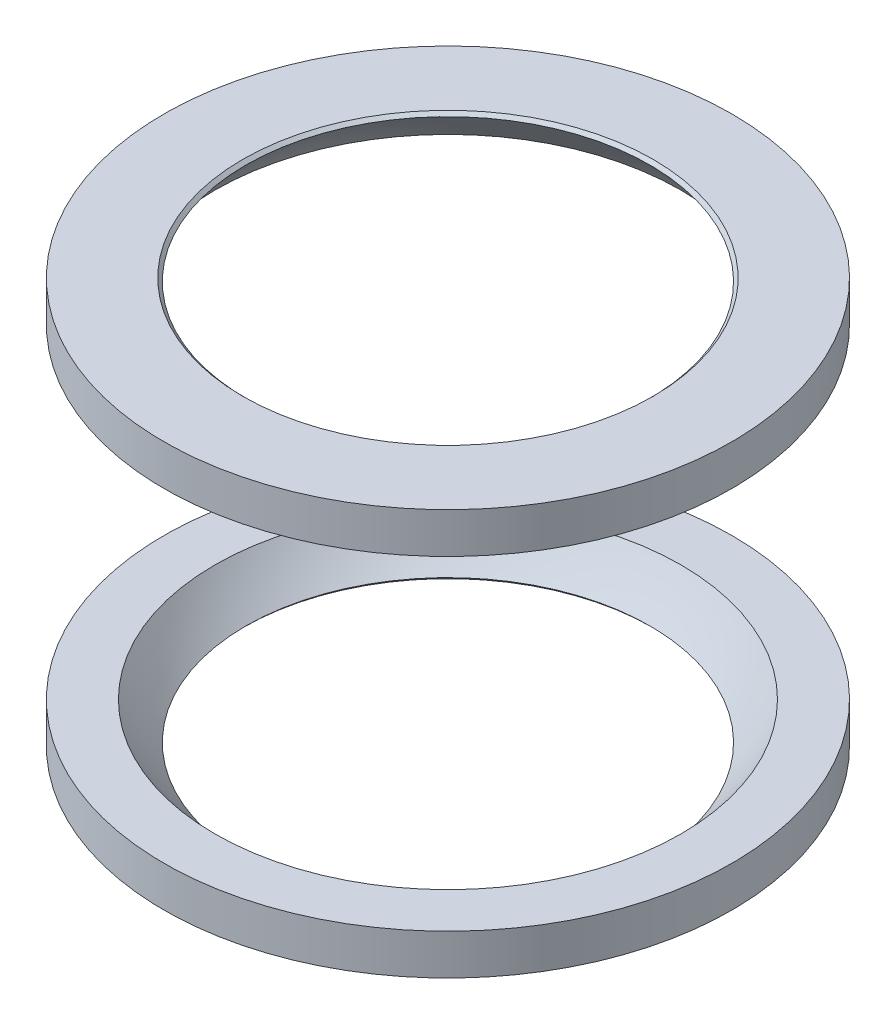
ISO-10303-21;
HEADER;
FILE_DESCRIPTION(('STEP AP214'),'2;1');
FILE_NAME('part.step','',(''),(''),'','','');
FILE_SCHEMA(('AUTOMOTIVE_DESIGN { 1 0 10303 214 1 1 1 1 }'));
ENDSEC;
DATA;
#1=APPLICATION_CONTEXT('core data for automotive mechanical design processes');
#2=APPLICATION_PROTOCOL_DEFINITION('international standard','automotive_design',2000,#1);
#3=PRODUCT_CONTEXT('',#1,'mechanical');
#4=PRODUCT('Part','Part','',(#3));
#5=PRODUCT_RELATED_PRODUCT_CATEGORY('part','',(#4));
#6=PRODUCT_DEFINITION_FORMATION('','',#4);
#7=PRODUCT_DEFINITION_CONTEXT('part definition',#1,'design');
#8=PRODUCT_DEFINITION('design','',#6,#7);
#9=PRODUCT_DEFINITION_SHAPE('','',#8);
#10=(LENGTH_UNIT() NAMED_UNIT(*) SI_UNIT(.MILLI.,.METRE.));
#11=(NAMED_UNIT(*) PLANE_ANGLE_UNIT() SI_UNIT($,.RADIAN.));
#12=(NAMED_UNIT(*) SI_UNIT($,.STERADIAN.) SOLID_ANGLE_UNIT());
#13=UNCERTAINTY_MEASURE_WITH_UNIT(LENGTH_MEASURE(1.E-05),#10,'distance_accuracy_value','');
#14=(GEOMETRIC_REPRESENTATION_CONTEXT(3) GLOBAL_UNCERTAINTY_ASSIGNED_CONTEXT((#13)) GLOBAL_UNIT_ASSIGNED_CONTEXT((#10,
#11,#12)) REPRESENTATION_CONTEXT('',''));
#15=CARTESIAN_POINT('',(0.,0.,0.));
#16=DIRECTION('',(0.,0.,1.));
#17=DIRECTION('',(1.,0.,0.));
#18=AXIS2_PLACEMENT_3D('',#15,#16,#17);
#19=CARTESIAN_POINT('',(0.,19.05,0.));
#20=DIRECTION('',(0.,-1.,0.));
#21=DIRECTION('',(0.,0.,-1.));
#22=AXIS2_PLACEMENT_3D('',#19,#20,#21);
#23=CYLINDRICAL_SURFACE('',#22,11.1125);
#24=CARTESIAN_POINT('',(0.,17.4625,0.));
#25=DIRECTION('',(0.,-1.,0.));
#26=DIRECTION('',(0.,0.,-1.));
#27=AXIS2_PLACEMENT_3D('',#24,#25,#26);
#28=CIRCLE('',#27,11.1125);
#29=CARTESIAN_POINT('',(0.,17.4625,-11.1125));
#30=VERTEX_POINT('',#29);
#31=EDGE_CURVE('E61',#30,#30,#28,.T.);
#32=CARTESIAN_POINT('',(0.,15.875,0.));
#33=DIRECTION('',(0.,1.,0.));
#34=DIRECTION('',(0.,0.,1.));
#35=AXIS2_PLACEMENT_3D('',#32,#33,#34);
#36=CIRCLE('',#35,11.1125);
#37=CARTESIAN_POINT('',(0.,15.875,-11.1125));
#38=VERTEX_POINT('',#37);
#39=EDGE_CURVE('E53',#38,#38,#36,.T.);
#40=CARTESIAN_POINT('',(0.,17.4625,-11.1125));
#41=CARTESIAN_POINT('',(0.,17.4459635416667,-11.1125));
#42=CARTESIAN_POINT('',(0.,17.4294270833333,-11.1125));
#43=CARTESIAN_POINT('',(0.,17.3963541666667,-11.1125));
#44=CARTESIAN_POINT('',(0.,17.3798177083333,-11.1125));
#45=CARTESIAN_POINT('',(0.,17.3467447916667,-11.1125));
#46=CARTESIAN_POINT('',(0.,17.3302083333333,-11.1125));
#47=CARTESIAN_POINT('',(0.,17.2971354166667,-11.1125));
#48=CARTESIAN_POINT('',(0.,17.2805989583333,-11.1125));
#49=CARTESIAN_POINT('',(0.,17.2475260416667,-11.1125));
#50=CARTESIAN_POINT('',(0.,17.2309895833333,-11.1125));
#51=CARTESIAN_POINT('',(0.,17.1979166666667,-11.1125));
#52=CARTESIAN_POINT('',(0.,17.1813802083333,-11.1125));
#53=CARTESIAN_POINT('',(0.,17.1483072916667,-11.1125));
#54=CARTESIAN_POINT('',(0.,17.1317708333333,-11.1125));
#55=CARTESIAN_POINT('',(0.,17.0986979166667,-11.1125));
#56=CARTESIAN_POINT('',(0.,17.0821614583333,-11.1125));
#57=CARTESIAN_POINT('',(0.,17.0490885416667,-11.1125));
#58=CARTESIAN_POINT('',(0.,17.0325520833333,-11.1125));
#59=CARTESIAN_POINT('',(0.,16.9994791666667,-11.1125));
#60=CARTESIAN_POINT('',(0.,16.9829427083333,-11.1125));
#61=CARTESIAN_POINT('',(0.,16.9498697916667,-11.1125));
#62=CARTESIAN_POINT('',(0.,16.9333333333333,-11.1125));
#63=CARTESIAN_POINT('',(0.,16.9002604166667,-11.1125));
#64=CARTESIAN_POINT('',(0.,16.8837239583333,-11.1125));
#65=CARTESIAN_POINT('',(0.,16.8506510416667,-11.1125));
#66=CARTESIAN_POINT('',(0.,16.8341145833333,-11.1125));
#67=CARTESIAN_POINT('',(0.,16.8010416666667,-11.1125));
#68=CARTESIAN_POINT('',(0.,16.7845052083333,-11.1125));
#69=CARTESIAN_POINT('',(0.,16.7514322916667,-11.1125));
#70=CARTESIAN_POINT('',(0.,16.7348958333333,-11.1125));
#71=CARTESIAN_POINT('',(0.,16.7018229166667,-11.1125));
#72=CARTESIAN_POINT('',(0.,16.6852864583333,-11.1125));
#73=CARTESIAN_POINT('',(0.,16.6522135416667,-11.1125));
#74=CARTESIAN_POINT('',(0.,16.6356770833333,-11.1125));
#75=CARTESIAN_POINT('',(0.,16.6026041666667,-11.1125));
#76=CARTESIAN_POINT('',(0.,16.5860677083333,-11.1125));
#77=CARTESIAN_POINT('',(0.,16.5529947916667,-11.1125));
#78=CARTESIAN_POINT('',(0.,16.5364583333333,-11.1125));
#79=CARTESIAN_POINT('',(0.,16.5033854166667,-11.1125));
#80=CARTESIAN_POINT('',(0.,16.4868489583333,-11.1125));
#81=CARTESIAN_POINT('',(0.,16.4537760416667,-11.1125));
#82=CARTESIAN_POINT('',(0.,16.4372395833333,-11.1125));
#83=CARTESIAN_POINT('',(0.,16.4041666666667,-11.1125));
#84=CARTESIAN_POINT('',(0.,16.3876302083333,-11.1125));
#85=CARTESIAN_POINT('',(0.,16.3545572916667,-11.1125));
#86=CARTESIAN_POINT('',(0.,16.3380208333333,-11.1125));
#87=CARTESIAN_POINT('',(0.,16.3049479166667,-11.1125));
#88=CARTESIAN_POINT('',(0.,16.2884114583333,-11.1125));
#89=CARTESIAN_POINT('',(0.,16.2553385416667,-11.1125));
#90=CARTESIAN_POINT('',(0.,16.2388020833333,-11.1125));
#91=CARTESIAN_POINT('',(0.,16.2057291666667,-11.1125));
#92=CARTESIAN_POINT('',(0.,16.1891927083333,-11.1125));
#93=CARTESIAN_POINT('',(0.,16.1561197916667,-11.1125));
#94=CARTESIAN_POINT('',(0.,16.1395833333333,-11.1125));
#95=CARTESIAN_POINT('',(0.,16.1065104166667,-11.1125));
#96=CARTESIAN_POINT('',(0.,16.0899739583333,-11.1125));
#97=CARTESIAN_POINT('',(0.,16.0569010416667,-11.1125));
#98=CARTESIAN_POINT('',(0.,16.0403645833333,-11.1125));
#99=CARTESIAN_POINT('',(0.,16.0072916666667,-11.1125));
#100=CARTESIAN_POINT('',(0.,15.9907552083333,-11.1125));
#101=CARTESIAN_POINT('',(0.,15.9576822916667,-11.1125));
#102=CARTESIAN_POINT('',(0.,15.9411458333333,-11.1125));
#103=CARTESIAN_POINT('',(0.,15.9080729166667,-11.1125));
#104=CARTESIAN_POINT('',(0.,15.8915364583333,-11.1125));
#105=CARTESIAN_POINT('',(0.,15.875,-11.1125));
#106=B_SPLINE_CURVE_WITH_KNOTS('',3,(#40,#41,#42,#43,#44,#45,#46,#47,#48,#49,#50,#51,#52,#53,
#54,#55,#56,#57,#58,#59,#60,#61,#62,#63,#64,#65,#66,#67,#68,#69,#70,#71,#72,#73,#74,#75,#76,#77,
#78,#79,#80,#81,#82,#83,#84,#85,#86,#87,#88,#89,#90,#91,#92,#93,#94,#95,#96,#97,#98,#99,#100,
#101,#102,#103,#104,#105),.UNSPECIFIED.,.F.,.F.,(4,2,2,2,2,2,2,2,2,2,2,2,2,2,2,2,2,2,2,2,2,2,2,
2,2,2,2,2,2,2,2,2,4),(0.,0.0496093749999989,0.0992187499999977,0.148828125,0.198437499999999,
0.248046874999998,0.29765625,0.347265624999999,0.396874999999998,0.446484375,0.496093749999999,
0.545703124999998,0.5953125,0.644921874999999,0.694531249999998,0.744140625,0.793749999999999,
0.843359374999998,0.892968750000001,0.942578124999999,0.992187499999998,1.041796875,1.09140625,
1.141015625,1.190625,1.240234375,1.28984375,1.339453125,1.3890625,1.438671875,1.48828125,
1.537890625,1.5875),.UNSPECIFIED.);
#107=EDGE_CURVE('BSEAM42',#30,#38,#106,.T.);
#108=ORIENTED_EDGE('',*,*,#31,.T.);
#109=ORIENTED_EDGE('',*,*,#39,.T.);
#110=ORIENTED_EDGE('',*,*,#107,.T.);
#111=ORIENTED_EDGE('',*,*,#107,.F.);
#112=EDGE_LOOP('',(#108,#110,#109,#111));
#113=FACE_BOUND('',#112,.T.);
#114=ADVANCED_FACE('F42',(#113),#23,.T.);
#115=CARTESIAN_POINT('',(0.,9.525,0.));
#116=DIRECTION('',(0.,1.,0.));
#117=DIRECTION('',(-1.,0.,0.));
#118=AXIS2_PLACEMENT_3D('',#115,#116,#117);
#119=SPHERICAL_SURFACE('',#118,11.1125);
#120=CARTESIAN_POINT('',(0.,17.3357696802761,0.));
#121=DIRECTION('',(0.,-1.,0.));
#122=DIRECTION('',(0.,0.,-1.));
#123=AXIS2_PLACEMENT_3D('',#120,#121,#122);
#124=CIRCLE('',#123,7.90439961361267);
#125=CARTESIAN_POINT('',(-7.90439961361267,17.3357696802761,0.));
#126=VERTEX_POINT('',#125);
#127=EDGE_CURVE('E49',#126,#126,#124,.F.);
#128=CARTESIAN_POINT('',(0.,15.875,0.));
#129=DIRECTION('',(0.,1.,0.));
#130=DIRECTION('',(0.,0.,1.));
#131=AXIS2_PLACEMENT_3D('',#128,#129,#130);
#132=CIRCLE('',#131,9.11949320137912);
#133=CARTESIAN_POINT('',(-9.11949320137912,15.875,0.));
#134=VERTEX_POINT('',#133);
#135=EDGE_CURVE('E57',#134,#134,#132,.F.);
#136=CARTESIAN_POINT('',(-7.90439961361267,17.3357696802761,0.));
#137=CARTESIAN_POINT('',(-7.91832839046159,17.3216739359647,0.));
#138=CARTESIAN_POINT('',(-7.93221946159132,17.3075409325765,0.));
#139=CARTESIAN_POINT('',(-7.95992579655185,17.2792008138154,0.));
#140=CARTESIAN_POINT('',(-7.97374106038264,17.2649936984426,0.));
#141=CARTESIAN_POINT('',(-8.00129538488472,17.236505761881,0.));
#142=CARTESIAN_POINT('',(-8.01503444555602,17.2222249406923,0.));
#143=CARTESIAN_POINT('',(-8.04243597064087,17.1935900013458,0.));
#144=CARTESIAN_POINT('',(-8.05609843505443,17.179235883188,0.));
#145=CARTESIAN_POINT('',(-8.08334637656208,17.1504547606956,0.));
#146=CARTESIAN_POINT('',(-8.09693185365616,17.136027756361,0.));
#147=CARTESIAN_POINT('',(-8.12402543170824,17.107101274434,0.));
#148=CARTESIAN_POINT('',(-8.13753353266624,17.0926017968416,0.));
#149=CARTESIAN_POINT('',(-8.16447197183295,17.0635307833815,0.));
#150=CARTESIAN_POINT('',(-8.17790231004166,17.0489592475138,0.));
#151=CARTESIAN_POINT('',(-8.20468483932517,17.0197445345508,0.));
#152=CARTESIAN_POINT('',(-8.21803703039998,17.0051013574554,0.));
#153=CARTESIAN_POINT('',(-8.24466288326692,16.9757437811344,0.));
#154=CARTESIAN_POINT('',(-8.25793654505905,16.9610293819088,0.));
#155=CARTESIAN_POINT('',(-8.28440495945962,16.9315297824631,0.));
#156=CARTESIAN_POINT('',(-8.29759971206806,16.9167445822431,0.));
#157=CARTESIAN_POINT('',(-8.32390993045864,16.887103803971,0.));
#158=CARTESIAN_POINT('',(-8.33702539624077,16.8722482259189,0.));
#159=CARTESIAN_POINT('',(-8.36317666560534,16.8424671171592,0.));
#160=CARTESIAN_POINT('',(-8.37621246918778,16.8275415864516,0.));
#161=CARTESIAN_POINT('',(-8.40220404105959,16.7976209995595,0.));
#162=CARTESIAN_POINT('',(-8.41515980934896,16.782625943375,0.));
#163=CARTESIAN_POINT('',(-8.44099093983189,16.7525667346977,0.));
#164=CARTESIAN_POINT('',(-8.45386630202545,16.7375025822048,0.));
#165=CARTESIAN_POINT('',(-8.47953625181532,16.7073056120568,0.));
#166=CARTESIAN_POINT('',(-8.49233083941162,16.6921727944016,0.));
#167=CARTESIAN_POINT('',(-8.51783887381735,16.6618389270403,0.));
#168=CARTESIAN_POINT('',(-8.53055232062677,16.6466378773342,0.));
#169=CARTESIAN_POINT('',(-8.55589770959141,16.6161679809352,0.));
#170=CARTESIAN_POINT('',(-8.56852965174663,16.6008991342423,0.));
#171=CARTESIAN_POINT('',(-8.59371166986824,16.5702940808743,0.));
#172=CARTESIAN_POINT('',(-8.60626174583464,16.5549578741992,0.));
#173=CARTESIAN_POINT('',(-8.63127967238708,16.5242185397993,0.));
#174=CARTESIAN_POINT('',(-8.64374752297312,16.5088154120744,0.));
#175=CARTESIAN_POINT('',(-8.66860064192666,16.4779426764228,0.));
#176=CARTESIAN_POINT('',(-8.68098591029414,16.462473068496,0.));
#177=CARTESIAN_POINT('',(-8.70567351033593,16.4314678151909,0.));
#178=CARTESIAN_POINT('',(-8.71797584201022,16.4159321698126,0.));
#179=CARTESIAN_POINT('',(-8.74249721656469,16.3847952862451,0.));
#180=CARTESIAN_POINT('',(-8.75471625944486,16.3691940480559,0.));
#181=CARTESIAN_POINT('',(-8.77907070669391,16.3379264253844,0.));
#182=CARTESIAN_POINT('',(-8.79120611106279,16.3222600409021,0.));
#183=CARTESIAN_POINT('',(-8.81539293396592,16.2908625740268,0.));
#184=CARTESIAN_POINT('',(-8.82744435250017,16.2751314916337,0.));
#185=CARTESIAN_POINT('',(-8.85146285881434,16.243605079171,0.));
#186=CARTESIAN_POINT('',(-8.86342994659427,16.2278097491013,0.));
#187=CARTESIAN_POINT('',(-8.88727944889396,16.1961552933581,0.));
#188=CARTESIAN_POINT('',(-8.89916186341372,16.1802961676848,0.));
#189=CARTESIAN_POINT('',(-8.92284167910974,16.1485145746325,0.));
#190=CARTESIAN_POINT('',(-8.934639080286,16.1325921072537,0.));
#191=CARTESIAN_POINT('',(-8.95814853164821,16.1006842865042,0.));
#192=CARTESIAN_POINT('',(-8.96986058183417,16.0846989331334,0.));
#193=CARTESIAN_POINT('',(-8.99319899599903,16.0526657979045,0.));
#194=CARTESIAN_POINT('',(-9.00482535997792,16.0366180160462,0.));
#195=CARTESIAN_POINT('',(-9.027992069012,16.0044604831669,0.));
#196=CARTESIAN_POINT('',(-9.03953241406717,15.9883507321459,0.));
#197=CARTESIAN_POINT('',(-9.06252675482097,15.9560697219138,0.));
#198=CARTESIAN_POINT('',(-9.07398075051959,15.9398984627029,0.));
#199=CARTESIAN_POINT('',(-9.09680206526353,15.9074948992924,0.));
#200=CARTESIAN_POINT('',(-9.10816938430884,15.891262595093,0.));
#201=CARTESIAN_POINT('',(-9.11949320137912,15.875,0.));
#202=B_SPLINE_CURVE_WITH_KNOTS('',3,(#136,#137,#138,#139,#140,#141,#142,#143,#144,#145,#146,
#147,#148,#149,#150,#151,#152,#153,#154,#155,#156,#157,#158,#159,#160,#161,#162,#163,#164,#165,
#166,#167,#168,#169,#170,#171,#172,#173,#174,#175,#176,#177,#178,#179,#180,#181,#182,#183,#184,
#185,#186,#187,#188,#189,#190,#191,#192,#193,#194,#195,#196,#197,#198,#199,#200,#201),
.UNSPECIFIED.,.F.,.F.,(4,2,2,2,2,2,2,2,2,2,2,2,2,2,2,2,2,2,2,2,2,2,2,2,2,2,2,2,2,2,2,2,4),(0.,
0.0594499710618457,0.118899942123693,0.178349913185542,0.23779988424739,0.297249855309237,
0.356699826371086,0.416149797432933,0.475599768494781,0.535049739556627,0.594499710618476,
0.653949681680324,0.713399652742172,0.772849623804018,0.832299594865865,0.891749565927715,
0.951199536989563,1.01064950805141,1.07009947911326,1.12954945017511,1.18899942123695,
1.2484493922988,1.30789936336065,1.3673493344225,1.42679930548434,1.48624927654619,
1.54569924760804,1.60514921866989,1.66459918973173,1.72404916079358,1.78349913185543,
1.84294910291728,1.90239907397913),.UNSPECIFIED.);
#203=EDGE_CURVE('BSEAM77',#126,#134,#202,.T.);
#204=ORIENTED_EDGE('',*,*,#127,.T.);
#205=ORIENTED_EDGE('',*,*,#135,.T.);
#206=ORIENTED_EDGE('',*,*,#203,.T.);
#207=ORIENTED_EDGE('',*,*,#203,.F.);
#208=EDGE_LOOP('',(#204,#206,#205,#207));
#209=FACE_BOUND('',#208,.T.);
#210=ADVANCED_FACE('F77',(#209),#119,.F.);
#211=CARTESIAN_POINT('',(-15.2621896314606,15.875,-25.4));
#212=DIRECTION('',(0.,1.,0.));
#213=DIRECTION('',(0.,0.,1.));
#214=AXIS2_PLACEMENT_3D('',#211,#212,#213);
#215=PLANE('',#214);
#216=ORIENTED_EDGE('',*,*,#135,.F.);
#217=EDGE_LOOP('',(#216));
#218=FACE_BOUND('',#217,.T.);
#219=ORIENTED_EDGE('',*,*,#39,.F.);
#220=EDGE_LOOP('',(#219));
#221=FACE_BOUND('',#220,.T.);
#222=ADVANCED_FACE('F70',(#218,#221),#215,.F.);
#223=CARTESIAN_POINT('',(11.1125,17.4625,-25.4));
#224=DIRECTION('',(0.,-1.,0.));
#225=DIRECTION('',(0.,0.,-1.));
#226=AXIS2_PLACEMENT_3D('',#223,#224,#225);
#227=PLANE('',#226);
#228=CARTESIAN_POINT('',(0.,17.4625,0.));
#229=DIRECTION('',(0.,-1.,0.));
#230=DIRECTION('',(0.,0.,-1.));
#231=AXIS2_PLACEMENT_3D('',#228,#229,#230);
#232=CIRCLE('',#231,8.0311299333366);
#233=CARTESIAN_POINT('',(0.,17.4625,-8.0311299333366));
#234=VERTEX_POINT('',#233);
#235=EDGE_CURVE('E11',#234,#234,#232,.T.);
#236=ORIENTED_EDGE('',*,*,#235,.T.);
#237=EDGE_LOOP('',(#236));
#238=FACE_BOUND('',#237,.T.);
#239=ORIENTED_EDGE('',*,*,#31,.F.);
#240=EDGE_LOOP('',(#239));
#241=FACE_BOUND('',#240,.T.);
#242=ADVANCED_FACE('F68',(#238,#241),#227,.F.);
#243=CARTESIAN_POINT('',(0.,17.3357696802761,0.));
#244=DIRECTION('',(0.,1.,0.));
#245=DIRECTION('',(0.,0.,1.));
#246=AXIS2_PLACEMENT_3D('',#243,#244,#245);
#247=CONICAL_SURFACE('',#246,7.90439961361267,0.785398163397435);
#248=ORIENTED_EDGE('',*,*,#235,.F.);
#249=EDGE_LOOP('',(#248));
#250=FACE_BOUND('',#249,.T.);
#251=ORIENTED_EDGE('',*,*,#127,.F.);
#252=EDGE_LOOP('',(#251));
#253=FACE_BOUND('',#252,.T.);
#254=ADVANCED_FACE('F44',(#250,#253),#247,.F.);
#255=CLOSED_SHELL('',(#114,#210,#222,#242,#254));
#256=MANIFOLD_SOLID_BREP('B2',#255);
#257=CARTESIAN_POINT('',(0.,19.05,0.));
#258=DIRECTION('',(0.,-1.,0.));
#259=DIRECTION('',(0.,0.,-1.));
#260=AXIS2_PLACEMENT_3D('',#257,#258,#259);
#261=CYLINDRICAL_SURFACE('',#260,11.1125);
#262=CARTESIAN_POINT('',(0.,3.175,0.));
#263=DIRECTION('',(0.,-1.,0.));
#264=DIRECTION('',(0.,0.,-1.));
#265=AXIS2_PLACEMENT_3D('',#262,#263,#264);
#266=CIRCLE('',#265,11.1125);
#267=CARTESIAN_POINT('',(0.,3.175,-11.1125));
#268=VERTEX_POINT('',#267);
#269=EDGE_CURVE('E139',#268,#268,#266,.T.);
#270=CARTESIAN_POINT('',(0.,1.5875,0.));
#271=DIRECTION('',(0.,1.,0.));
#272=DIRECTION('',(-1.,0.,0.));
#273=AXIS2_PLACEMENT_3D('',#270,#271,#272);
#274=CIRCLE('',#273,11.1125);
#275=CARTESIAN_POINT('',(0.,1.5875,-11.1125));
#276=VERTEX_POINT('',#275);
#277=EDGE_CURVE('E147',#276,#276,#274,.T.);
#278=CARTESIAN_POINT('',(0.,3.175,-11.1125));
#279=CARTESIAN_POINT('',(0.,3.15846354166667,-11.1125));
#280=CARTESIAN_POINT('',(0.,3.14192708333334,-11.1125));
#281=CARTESIAN_POINT('',(0.,3.10885416666667,-11.1125));
#282=CARTESIAN_POINT('',(0.,3.09231770833334,-11.1125));
#283=CARTESIAN_POINT('',(0.,3.05924479166667,-11.1125));
#284=CARTESIAN_POINT('',(0.,3.04270833333334,-11.1125));
#285=CARTESIAN_POINT('',(0.,3.00963541666667,-11.1125));
#286=CARTESIAN_POINT('',(0.,2.99309895833334,-11.1125));
#287=CARTESIAN_POINT('',(0.,2.96002604166667,-11.1125));
#288=CARTESIAN_POINT('',(0.,2.94348958333334,-11.1125));
#289=CARTESIAN_POINT('',(0.,2.91041666666667,-11.1125));
#290=CARTESIAN_POINT('',(0.,2.89388020833334,-11.1125));
#291=CARTESIAN_POINT('',(0.,2.86080729166667,-11.1125));
#292=CARTESIAN_POINT('',(0.,2.84427083333334,-11.1125));
#293=CARTESIAN_POINT('',(0.,2.81119791666667,-11.1125));
#294=CARTESIAN_POINT('',(0.,2.79466145833334,-11.1125));
#295=CARTESIAN_POINT('',(0.,2.76158854166667,-11.1125));
#296=CARTESIAN_POINT('',(0.,2.74505208333334,-11.1125));
#297=CARTESIAN_POINT('',(0.,2.71197916666667,-11.1125));
#298=CARTESIAN_POINT('',(0.,2.69544270833334,-11.1125));
#299=CARTESIAN_POINT('',(0.,2.66236979166667,-11.1125));
#300=CARTESIAN_POINT('',(0.,2.64583333333334,-11.1125));
#301=CARTESIAN_POINT('',(0.,2.61276041666667,-11.1125));
#302=CARTESIAN_POINT('',(0.,2.59622395833334,-11.1125));
#303=CARTESIAN_POINT('',(0.,2.56315104166667,-11.1125));
#304=CARTESIAN_POINT('',(0.,2.54661458333334,-11.1125));
#305=CARTESIAN_POINT('',(0.,2.51354166666667,-11.1125));
#306=CARTESIAN_POINT('',(0.,2.49700520833334,-11.1125));
#307=CARTESIAN_POINT('',(0.,2.46393229166667,-11.1125));
#308=CARTESIAN_POINT('',(0.,2.44739583333333,-11.1125));
#309=CARTESIAN_POINT('',(0.,2.41432291666667,-11.1125));
#310=CARTESIAN_POINT('',(0.,2.39778645833333,-11.1125));
#311=CARTESIAN_POINT('',(0.,2.36471354166667,-11.1125));
#312=CARTESIAN_POINT('',(0.,2.34817708333334,-11.1125));
#313=CARTESIAN_POINT('',(0.,2.31510416666667,-11.1125));
#314=CARTESIAN_POINT('',(0.,2.29856770833333,-11.1125));
#315=CARTESIAN_POINT('',(0.,2.26549479166667,-11.1125));
#316=CARTESIAN_POINT('',(0.,2.24895833333333,-11.1125));
#317=CARTESIAN_POINT('',(0.,2.21588541666667,-11.1125));
#318=CARTESIAN_POINT('',(0.,2.19934895833333,-11.1125));
#319=CARTESIAN_POINT('',(0.,2.16627604166667,-11.1125));
#320=CARTESIAN_POINT('',(0.,2.14973958333333,-11.1125));
#321=CARTESIAN_POINT('',(0.,2.11666666666667,-11.1125));
#322=CARTESIAN_POINT('',(0.,2.10013020833333,-11.1125));
#323=CARTESIAN_POINT('',(0.,2.06705729166667,-11.1125));
#324=CARTESIAN_POINT('',(0.,2.05052083333333,-11.1125));
#325=CARTESIAN_POINT('',(0.,2.01744791666667,-11.1125));
#326=CARTESIAN_POINT('',(0.,2.00091145833333,-11.1125));
#327=CARTESIAN_POINT('',(0.,1.96783854166667,-11.1125));
#328=CARTESIAN_POINT('',(0.,1.95130208333333,-11.1125));
#329=CARTESIAN_POINT('',(0.,1.91822916666667,-11.1125));
#330=CARTESIAN_POINT('',(0.,1.90169270833333,-11.1125));
#331=CARTESIAN_POINT('',(0.,1.86861979166667,-11.1125));
#332=CARTESIAN_POINT('',(0.,1.85208333333333,-11.1125));
#333=CARTESIAN_POINT('',(0.,1.81901041666667,-11.1125));
#334=CARTESIAN_POINT('',(0.,1.80247395833333,-11.1125));
#335=CARTESIAN_POINT('',(0.,1.76940104166667,-11.1125));
#336=CARTESIAN_POINT('',(0.,1.75286458333333,-11.1125));
#337=CARTESIAN_POINT('',(0.,1.71979166666667,-11.1125));
#338=CARTESIAN_POINT('',(0.,1.70325520833333,-11.1125));
#339=CARTESIAN_POINT('',(0.,1.67018229166667,-11.1125));
#340=CARTESIAN_POINT('',(0.,1.65364583333333,-11.1125));
#341=CARTESIAN_POINT('',(0.,1.62057291666666,-11.1125));
#342=CARTESIAN_POINT('',(0.,1.60403645833333,-11.1125));
#343=CARTESIAN_POINT('',(0.,1.5875,-11.1125));
#344=B_SPLINE_CURVE_WITH_KNOTS('',3,(#278,#279,#280,#281,#282,#283,#284,#285,#286,#287,#288,
#289,#290,#291,#292,#293,#294,#295,#296,#297,#298,#299,#300,#301,#302,#303,#304,#305,#306,#307,
#308,#309,#310,#311,#312,#313,#314,#315,#316,#317,#318,#319,#320,#321,#322,#323,#324,#325,#326,
#327,#328,#329,#330,#331,#332,#333,#334,#335,#336,#337,#338,#339,#340,#341,#342,#343),
.UNSPECIFIED.,.F.,.F.,(4,2,2,2,2,2,2,2,2,2,2,2,2,2,2,2,2,2,2,2,2,2,2,2,2,2,2,2,2,2,2,2,4),(0.,
0.0496093749999989,0.0992187500000012,0.148828125,0.198437500000002,0.248046875000001,
0.29765625,0.347265625000003,0.396875000000001,0.446484375,0.496093750000003,0.545703125000002,
0.5953125,0.644921875000003,0.694531250000002,0.744140625000004,0.793750000000003,
0.843359375000002,0.892968750000004,0.942578125000003,0.992187500000005,1.041796875,1.09140625,
1.14101562500001,1.190625,1.240234375,1.28984375000001,1.339453125,1.3890625,1.43867187500001,
1.48828125,1.53789062500001,1.58750000000001),.UNSPECIFIED.);
#345=EDGE_CURVE('BSEAM128',#268,#276,#344,.T.);
#346=ORIENTED_EDGE('',*,*,#269,.T.);
#347=ORIENTED_EDGE('',*,*,#277,.T.);
#348=ORIENTED_EDGE('',*,*,#345,.T.);
#349=ORIENTED_EDGE('',*,*,#345,.F.);
#350=EDGE_LOOP('',(#346,#348,#347,#349));
#351=FACE_BOUND('',#350,.T.);
#352=ADVANCED_FACE('F128',(#351),#261,.T.);
#353=CARTESIAN_POINT('',(0.,9.525,0.));
#354=DIRECTION('',(0.,1.,0.));
#355=DIRECTION('',(-1.,0.,0.));
#356=AXIS2_PLACEMENT_3D('',#353,#354,#355);
#357=SPHERICAL_SURFACE('',#356,11.1125);
#358=CARTESIAN_POINT('',(0.,1.71423031972393,0.));
#359=DIRECTION('',(0.,1.,0.));
#360=DIRECTION('',(-1.,0.,0.));
#361=AXIS2_PLACEMENT_3D('',#358,#359,#360);
#362=CIRCLE('',#361,7.90439961361266);
#363=CARTESIAN_POINT('',(-7.90439961361266,1.71423031972393,0.));
#364=VERTEX_POINT('',#363);
#365=EDGE_CURVE('E135',#364,#364,#362,.F.);
#366=CARTESIAN_POINT('',(0.,3.175,0.));
#367=DIRECTION('',(0.,-1.,0.));
#368=DIRECTION('',(0.,0.,-1.));
#369=AXIS2_PLACEMENT_3D('',#366,#367,#368);
#370=CIRCLE('',#369,9.11949320137912);
#371=CARTESIAN_POINT('',(-9.11949320137912,3.175,0.));
#372=VERTEX_POINT('',#371);
#373=EDGE_CURVE('E143',#372,#372,#370,.F.);
#374=CARTESIAN_POINT('',(-7.90439961361266,1.71423031972393,0.));
#375=CARTESIAN_POINT('',(-7.91832839046158,1.72832606403533,0.));
#376=CARTESIAN_POINT('',(-7.93221946159131,1.74245906742351,0.));
#377=CARTESIAN_POINT('',(-7.95992579655184,1.77079918618456,0.));
#378=CARTESIAN_POINT('',(-7.97374106038263,1.78500630155743,0.));
#379=CARTESIAN_POINT('',(-8.00129538488472,1.813494238119,0.));
#380=CARTESIAN_POINT('',(-8.01503444555601,1.8277750593077,0.));
#381=CARTESIAN_POINT('',(-8.04243597064086,1.85640999865418,0.));
#382=CARTESIAN_POINT('',(-8.05609843505443,1.87076411681197,0.));
#383=CARTESIAN_POINT('',(-8.08334637656207,1.8995452393044,0.));
#384=CARTESIAN_POINT('',(-8.09693185365615,1.91397224363903,0.));
#385=CARTESIAN_POINT('',(-8.12402543170824,1.94289872556604,0.));
#386=CARTESIAN_POINT('',(-8.13753353266624,1.95739820315841,0.));
#387=CARTESIAN_POINT('',(-8.16447197183295,1.98646921661849,0.));
#388=CARTESIAN_POINT('',(-8.17790231004165,2.00104075248619,0.));
#389=CARTESIAN_POINT('',(-8.20468483932517,2.03025546544924,0.));
#390=CARTESIAN_POINT('',(-8.21803703039998,2.04489864254458,0.));
#391=CARTESIAN_POINT('',(-8.24466288326691,2.07425621886558,0.));
#392=CARTESIAN_POINT('',(-8.25793654505904,2.08897061809124,0.));
#393=CARTESIAN_POINT('',(-8.28440495945961,2.1184702175369,0.));
#394=CARTESIAN_POINT('',(-8.29759971206806,2.13325541775691,0.));
#395=CARTESIAN_POINT('',(-8.32390993045863,2.16289619602901,0.));
#396=CARTESIAN_POINT('',(-8.33702539624076,2.17775177408109,0.));
#397=CARTESIAN_POINT('',(-8.36317666560534,2.20753288284078,0.));
#398=CARTESIAN_POINT('',(-8.37621246918778,2.22245841354839,0.));
#399=CARTESIAN_POINT('',(-8.40220404105959,2.2523790004405,0.));
#400=CARTESIAN_POINT('',(-8.41515980934896,2.26737405662499,0.));
#401=CARTESIAN_POINT('',(-8.44099093983188,2.29743326530235,0.));
#402=CARTESIAN_POINT('',(-8.45386630202544,2.31249741779522,0.));
#403=CARTESIAN_POINT('',(-8.47953625181531,2.34269438794325,0.));
#404=CARTESIAN_POINT('',(-8.49233083941162,2.35782720559841,0.));
#405=CARTESIAN_POINT('',(-8.51783887381735,2.38816107295968,0.));
#406=CARTESIAN_POINT('',(-8.53055232062677,2.4033621226658,0.));
#407=CARTESIAN_POINT('',(-8.55589770959141,2.43383201906481,0.));
#408=CARTESIAN_POINT('',(-8.56852965174662,2.4491008657577,0.));
#409=CARTESIAN_POINT('',(-8.59371166986824,2.47970591912569,0.));
#410=CARTESIAN_POINT('',(-8.60626174583464,2.4950421258008,0.));
#411=CARTESIAN_POINT('',(-8.63127967238708,2.52578146020074,0.));
#412=CARTESIAN_POINT('',(-8.64374752297312,2.54118458792559,0.));
#413=CARTESIAN_POINT('',(-8.66860064192665,2.57205732357724,0.));
#414=CARTESIAN_POINT('',(-8.68098591029414,2.58752693150405,0.));
#415=CARTESIAN_POINT('',(-8.70567351033593,2.61853218480913,0.));
#416=CARTESIAN_POINT('',(-8.71797584201022,2.6340678301874,0.));
#417=CARTESIAN_POINT('',(-8.74249721656468,2.66520471375488,0.));
#418=CARTESIAN_POINT('',(-8.75471625944485,2.68080595194409,0.));
#419=CARTESIAN_POINT('',(-8.7790707066939,2.71207357461561,0.));
#420=CARTESIAN_POINT('',(-8.79120611106279,2.72773995909792,0.));
#421=CARTESIAN_POINT('',(-8.81539293396592,2.75913742597325,0.));
#422=CARTESIAN_POINT('',(-8.82744435250017,2.77486850836628,0.));
#423=CARTESIAN_POINT('',(-8.85146285881434,2.80639492082903,0.));
#424=CARTESIAN_POINT('',(-8.86342994659426,2.82219025089874,0.));
#425=CARTESIAN_POINT('',(-8.88727944889395,2.85384470664185,0.));
#426=CARTESIAN_POINT('',(-8.89916186341372,2.86970383231525,0.));
#427=CARTESIAN_POINT('',(-8.92284167910974,2.90148542536746,0.));
#428=CARTESIAN_POINT('',(-8.93463908028599,2.91740789274629,0.));
#429=CARTESIAN_POINT('',(-8.95814853164821,2.94931571349584,0.));
#430=CARTESIAN_POINT('',(-8.96986058183417,2.96530106686656,0.));
#431=CARTESIAN_POINT('',(-8.99319899599903,2.99733420209554,0.));
#432=CARTESIAN_POINT('',(-9.00482535997792,3.01338198395379,0.));
#433=CARTESIAN_POINT('',(-9.02799206901199,3.04553951683309,0.));
#434=CARTESIAN_POINT('',(-9.03953241406717,3.06164926785415,0.));
#435=CARTESIAN_POINT('',(-9.06252675482097,3.09393027808618,0.));
#436=CARTESIAN_POINT('',(-9.07398075051959,3.11010153729715,0.));
#437=CARTESIAN_POINT('',(-9.09680206526352,3.14250510070757,0.));
#438=CARTESIAN_POINT('',(-9.10816938430884,3.15873740490703,0.));
#439=CARTESIAN_POINT('',(-9.11949320137912,3.175,0.));
#440=B_SPLINE_CURVE_WITH_KNOTS('',3,(#374,#375,#376,#377,#378,#379,#380,#381,#382,#383,#384,
#385,#386,#387,#388,#389,#390,#391,#392,#393,#394,#395,#396,#397,#398,#399,#400,#401,#402,#403,
#404,#405,#406,#407,#408,#409,#410,#411,#412,#413,#414,#415,#416,#417,#418,#419,#420,#421,#422,
#423,#424,#425,#426,#427,#428,#429,#430,#431,#432,#433,#434,#435,#436,#437,#438,#439),
.UNSPECIFIED.,.F.,.F.,(4,2,2,2,2,2,2,2,2,2,2,2,2,2,2,2,2,2,2,2,2,2,2,2,2,2,2,2,2,2,2,2,4),(0.,
0.0594499710618487,0.118899942123695,0.178349913185544,0.23779988424739,0.297249855309239,
0.356699826371087,0.416149797432935,0.475599768494783,0.535049739556632,0.594499710618479,
0.653949681680327,0.713399652742176,0.772849623804022,0.83229959486587,0.891749565927721,
0.951199536989567,1.01064950805141,1.07009947911326,1.12954945017511,1.18899942123696,
1.24844939229881,1.30789936336065,1.3673493344225,1.42679930548435,1.4862492765462,
1.54569924760805,1.60514921866989,1.66459918973174,1.72404916079359,1.78349913185544,
1.84294910291729,1.90239907397913),.UNSPECIFIED.);
#441=EDGE_CURVE('BSEAM162',#364,#372,#440,.T.);
#442=ORIENTED_EDGE('',*,*,#365,.T.);
#443=ORIENTED_EDGE('',*,*,#373,.T.);
#444=ORIENTED_EDGE('',*,*,#441,.T.);
#445=ORIENTED_EDGE('',*,*,#441,.F.);
#446=EDGE_LOOP('',(#442,#444,#443,#445));
#447=FACE_BOUND('',#446,.T.);
#448=ADVANCED_FACE('F162',(#447),#357,.F.);
#449=CARTESIAN_POINT('',(-15.2621896314606,3.175,-25.4));
#450=DIRECTION('',(0.,-1.,0.));
#451=DIRECTION('',(0.,0.,-1.));
#452=AXIS2_PLACEMENT_3D('',#449,#450,#451);
#453=PLANE('',#452);
#454=ORIENTED_EDGE('',*,*,#373,.F.);
#455=EDGE_LOOP('',(#454));
#456=FACE_BOUND('',#455,.T.);
#457=ORIENTED_EDGE('',*,*,#269,.F.);
#458=EDGE_LOOP('',(#457));
#459=FACE_BOUND('',#458,.T.);
#460=ADVANCED_FACE('F155',(#456,#459),#453,.F.);
#461=CARTESIAN_POINT('',(11.1125,1.5875,-25.4));
#462=DIRECTION('',(0.,1.,0.));
#463=DIRECTION('',(-1.,0.,0.));
#464=AXIS2_PLACEMENT_3D('',#461,#462,#463);
#465=PLANE('',#464);
#466=CARTESIAN_POINT('',(0.,1.5875,0.));
#467=DIRECTION('',(0.,1.,0.));
#468=DIRECTION('',(-1.,0.,0.));
#469=AXIS2_PLACEMENT_3D('',#466,#467,#468);
#470=CIRCLE('',#469,8.0311299333366);
#471=CARTESIAN_POINT('',(-8.0311299333366,1.5875,0.));
#472=VERTEX_POINT('',#471);
#473=EDGE_CURVE('E41',#472,#472,#470,.T.);
#474=ORIENTED_EDGE('',*,*,#473,.T.);
#475=EDGE_LOOP('',(#474));
#476=FACE_BOUND('',#475,.T.);
#477=ORIENTED_EDGE('',*,*,#277,.F.);
#478=EDGE_LOOP('',(#477));
#479=FACE_BOUND('',#478,.T.);
#480=ADVANCED_FACE('F153',(#476,#479),#465,.F.);
#481=CARTESIAN_POINT('',(0.,1.71423031972393,0.));
#482=DIRECTION('',(0.,-1.,0.));
#483=DIRECTION('',(1.,0.,0.));
#484=AXIS2_PLACEMENT_3D('',#481,#482,#483);
#485=CONICAL_SURFACE('',#484,7.90439961361266,0.785398163397462);
#486=ORIENTED_EDGE('',*,*,#473,.F.);
#487=EDGE_LOOP('',(#486));
#488=FACE_BOUND('',#487,.T.);
#489=ORIENTED_EDGE('',*,*,#365,.F.);
#490=EDGE_LOOP('',(#489));
#491=FACE_BOUND('',#490,.T.);
#492=ADVANCED_FACE('F130',(#488,#491),#485,.F.);
#493=CLOSED_SHELL('',(#352,#448,#460,#480,#492));
#494=MANIFOLD_SOLID_BREP('B6',#493);
#495=ADVANCED_BREP_SHAPE_REPRESENTATION('',(#18,#256,#494),#14);
#496=SHAPE_DEFINITION_REPRESENTATION(#9,#495);
ENDSEC;
END-ISO-10303-21;
